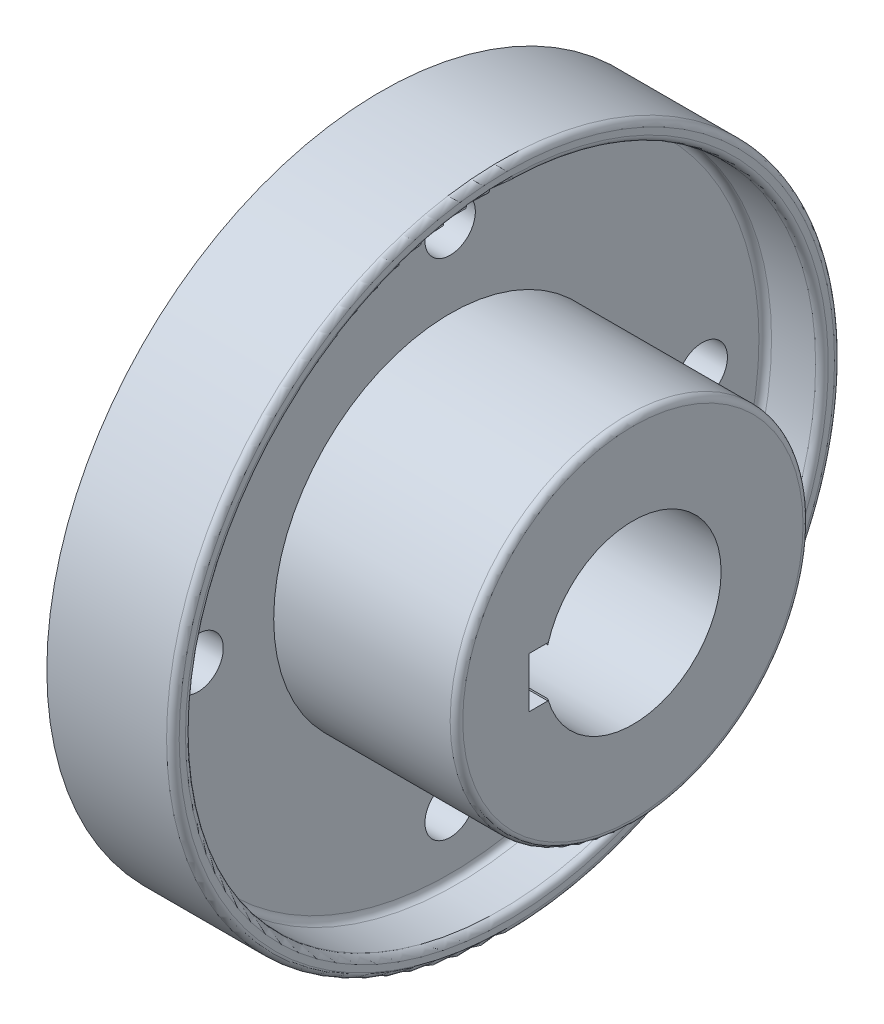
ISO-10303-21;
HEADER;
FILE_DESCRIPTION(('STEP AP214'),'2;1');
FILE_NAME('part.step','',(''),(''),'','','');
FILE_SCHEMA(('AUTOMOTIVE_DESIGN { 1 0 10303 214 1 1 1 1 }'));
ENDSEC;
DATA;
#1=APPLICATION_CONTEXT('core data for automotive mechanical design processes');
#2=APPLICATION_PROTOCOL_DEFINITION('international standard','automotive_design',2000,#1);
#3=PRODUCT_CONTEXT('',#1,'mechanical');
#4=PRODUCT('Part','Part','',(#3));
#5=PRODUCT_RELATED_PRODUCT_CATEGORY('part','',(#4));
#6=PRODUCT_DEFINITION_FORMATION('','',#4);
#7=PRODUCT_DEFINITION_CONTEXT('part definition',#1,'design');
#8=PRODUCT_DEFINITION('design','',#6,#7);
#9=PRODUCT_DEFINITION_SHAPE('','',#8);
#10=(LENGTH_UNIT() NAMED_UNIT(*) SI_UNIT(.MILLI.,.METRE.));
#11=(NAMED_UNIT(*) PLANE_ANGLE_UNIT() SI_UNIT($,.RADIAN.));
#12=(NAMED_UNIT(*) SI_UNIT($,.STERADIAN.) SOLID_ANGLE_UNIT());
#13=UNCERTAINTY_MEASURE_WITH_UNIT(LENGTH_MEASURE(1.E-05),#10,'distance_accuracy_value','');
#14=(GEOMETRIC_REPRESENTATION_CONTEXT(3) GLOBAL_UNCERTAINTY_ASSIGNED_CONTEXT((#13)) GLOBAL_UNIT_ASSIGNED_CONTEXT((#10,
#11,#12)) REPRESENTATION_CONTEXT('',''));
#15=CARTESIAN_POINT('',(0.,0.,0.));
#16=DIRECTION('',(0.,0.,1.));
#17=DIRECTION('',(1.,0.,0.));
#18=AXIS2_PLACEMENT_3D('',#15,#16,#17);
#19=CARTESIAN_POINT('',(0.,0.,0.));
#20=DIRECTION('',(1.,0.,0.));
#21=DIRECTION('',(0.,0.,-1.));
#22=AXIS2_PLACEMENT_3D('',#19,#20,#21);
#23=CYLINDRICAL_SURFACE('',#22,28.);
#24=CARTESIAN_POINT('',(80.,0.,0.));
#25=DIRECTION('',(1.,0.,0.));
#26=DIRECTION('',(0.,0.,-1.));
#27=AXIS2_PLACEMENT_3D('',#24,#25,#26);
#28=CIRCLE('',#27,28.);
#29=CARTESIAN_POINT('',(80.,-7.41619848709568,27.));
#30=VERTEX_POINT('',#29);
#31=CARTESIAN_POINT('',(80.,7.41619848709568,27.));
#32=VERTEX_POINT('',#31);
#33=EDGE_CURVE('E143',#30,#32,#28,.T.);
#34=ORIENTED_EDGE('',*,*,#33,.T.);
#35=DIRECTION('',(1.,0.,0.));
#36=VECTOR('',#35,1.);
#37=CARTESIAN_POINT('',(0.,7.41619848709568,27.));
#38=LINE('',#37,#36);
#39=CARTESIAN_POINT('',(6.,7.41619848709568,27.));
#40=VERTEX_POINT('',#39);
#41=EDGE_CURVE('E133',#32,#40,#38,.F.);
#42=ORIENTED_EDGE('',*,*,#41,.T.);
#43=CARTESIAN_POINT('',(6.,0.,0.));
#44=DIRECTION('',(-1.,0.,0.));
#45=DIRECTION('',(0.,0.,1.));
#46=AXIS2_PLACEMENT_3D('',#43,#44,#45);
#47=CIRCLE('',#46,28.);
#48=CARTESIAN_POINT('',(6.,-7.41619848709568,27.));
#49=VERTEX_POINT('',#48);
#50=EDGE_CURVE('E140',#49,#40,#47,.F.);
#51=ORIENTED_EDGE('',*,*,#50,.F.);
#52=DIRECTION('',(1.,0.,0.));
#53=VECTOR('',#52,1.);
#54=CARTESIAN_POINT('',(0.,-7.41619848709568,27.));
#55=LINE('',#54,#53);
#56=EDGE_CURVE('E127',#49,#30,#55,.T.);
#57=ORIENTED_EDGE('',*,*,#56,.T.);
#58=EDGE_LOOP('',(#34,#42,#51,#57));
#59=FACE_BOUND('',#58,.T.);
#60=ADVANCED_FACE('F33',(#59),#23,.F.);
#61=CARTESIAN_POINT('',(0.,106.,0.));
#62=DIRECTION('',(1.,0.,0.));
#63=DIRECTION('',(0.,0.,-1.));
#64=AXIS2_PLACEMENT_3D('',#61,#62,#63);
#65=PLANE('',#64);
#66=CARTESIAN_POINT('',(0.,8.34771439644569E-13,80.));
#67=DIRECTION('',(-1.,0.,0.));
#68=DIRECTION('',(0.,-1.,0.));
#69=AXIS2_PLACEMENT_3D('',#66,#67,#68);
#70=CIRCLE('',#69,8.);
#71=CARTESIAN_POINT('',(0.,-7.99999999999917,80.0000000000001));
#72=VERTEX_POINT('',#71);
#73=EDGE_CURVE('E193',#72,#72,#70,.T.);
#74=ORIENTED_EDGE('',*,*,#73,.F.);
#75=EDGE_LOOP('',(#74));
#76=FACE_BOUND('',#75,.T.);
#77=CARTESIAN_POINT('',(0.,-80.,0.));
#78=DIRECTION('',(-1.,0.,0.));
#79=DIRECTION('',(0.,0.,-1.));
#80=AXIS2_PLACEMENT_3D('',#77,#78,#79);
#81=CIRCLE('',#80,8.);
#82=CARTESIAN_POINT('',(0.,-80.,-8.00000000000001));
#83=VERTEX_POINT('',#82);
#84=EDGE_CURVE('E184',#83,#83,#81,.T.);
#85=ORIENTED_EDGE('',*,*,#84,.F.);
#86=EDGE_LOOP('',(#85));
#87=FACE_BOUND('',#86,.T.);
#88=CARTESIAN_POINT('',(0.,-2.76134425429668E-13,-80.));
#89=DIRECTION('',(-1.,0.,0.));
#90=DIRECTION('',(0.,1.,0.));
#91=AXIS2_PLACEMENT_3D('',#88,#89,#90);
#92=CIRCLE('',#91,8.);
#93=CARTESIAN_POINT('',(0.,7.99999999999973,-80.));
#94=VERTEX_POINT('',#93);
#95=EDGE_CURVE('E181',#94,#94,#92,.T.);
#96=ORIENTED_EDGE('',*,*,#95,.F.);
#97=EDGE_LOOP('',(#96));
#98=FACE_BOUND('',#97,.T.);
#99=CARTESIAN_POINT('',(0.,80.,0.));
#100=DIRECTION('',(-1.,0.,0.));
#101=DIRECTION('',(0.,0.,1.));
#102=AXIS2_PLACEMENT_3D('',#99,#100,#101);
#103=CIRCLE('',#102,8.);
#104=CARTESIAN_POINT('',(0.,80.,8.00000000000001));
#105=VERTEX_POINT('',#104);
#106=EDGE_CURVE('E114',#105,#105,#103,.T.);
#107=ORIENTED_EDGE('',*,*,#106,.F.);
#108=EDGE_LOOP('',(#107));
#109=FACE_BOUND('',#108,.T.);
#110=CARTESIAN_POINT('',(0.,0.,0.));
#111=DIRECTION('',(-1.,0.,0.));
#112=DIRECTION('',(0.,0.,1.));
#113=AXIS2_PLACEMENT_3D('',#110,#111,#112);
#114=CIRCLE('',#113,46.);
#115=CARTESIAN_POINT('',(0.,0.,46.));
#116=VERTEX_POINT('',#115);
#117=EDGE_CURVE('E136',#116,#116,#114,.T.);
#118=ORIENTED_EDGE('',*,*,#117,.F.);
#119=EDGE_LOOP('',(#118));
#120=FACE_BOUND('',#119,.T.);
#121=CARTESIAN_POINT('',(0.,0.,0.));
#122=DIRECTION('',(-1.,0.,0.));
#123=DIRECTION('',(0.,0.,1.));
#124=AXIS2_PLACEMENT_3D('',#121,#122,#123);
#125=CIRCLE('',#124,106.);
#126=CARTESIAN_POINT('',(0.,0.,106.));
#127=VERTEX_POINT('',#126);
#128=EDGE_CURVE('E146',#127,#127,#125,.T.);
#129=ORIENTED_EDGE('',*,*,#128,.T.);
#130=EDGE_LOOP('',(#129));
#131=FACE_BOUND('',#130,.T.);
#132=ADVANCED_FACE('F35',(#76,#87,#98,#109,#120,#131),#65,.F.);
#133=CARTESIAN_POINT('',(80.,0.,0.));
#134=DIRECTION('',(-1.,0.,0.));
#135=DIRECTION('',(0.,0.,1.));
#136=AXIS2_PLACEMENT_3D('',#133,#134,#135);
#137=PLANE('',#136);
#138=ORIENTED_EDGE('',*,*,#33,.F.);
#139=DIRECTION('',(0.,-1.,0.));
#140=VECTOR('',#139,1.);
#141=CARTESIAN_POINT('',(80.,-8.,27.));
#142=LINE('',#141,#140);
#143=CARTESIAN_POINT('',(80.,-8.,27.));
#144=VERTEX_POINT('',#143);
#145=EDGE_CURVE('E58',#30,#144,#142,.T.);
#146=ORIENTED_EDGE('',*,*,#145,.T.);
#147=DIRECTION('',(0.,0.,1.));
#148=VECTOR('',#147,1.);
#149=CARTESIAN_POINT('',(80.,-8.,27.));
#150=LINE('',#149,#148);
#151=CARTESIAN_POINT('',(80.,-8.,33.));
#152=VERTEX_POINT('',#151);
#153=EDGE_CURVE('E95',#144,#152,#150,.T.);
#154=ORIENTED_EDGE('',*,*,#153,.T.);
#155=DIRECTION('',(0.,1.,0.));
#156=VECTOR('',#155,1.);
#157=CARTESIAN_POINT('',(80.,-8.,33.));
#158=LINE('',#157,#156);
#159=CARTESIAN_POINT('',(80.,8.,33.));
#160=VERTEX_POINT('',#159);
#161=EDGE_CURVE('E89',#152,#160,#158,.T.);
#162=ORIENTED_EDGE('',*,*,#161,.T.);
#163=DIRECTION('',(0.,0.,-1.));
#164=VECTOR('',#163,1.);
#165=CARTESIAN_POINT('',(80.,8.,27.));
#166=LINE('',#165,#164);
#167=CARTESIAN_POINT('',(80.,8.,27.));
#168=VERTEX_POINT('',#167);
#169=EDGE_CURVE('E98',#160,#168,#166,.T.);
#170=ORIENTED_EDGE('',*,*,#169,.T.);
#171=EDGE_CURVE('E117',#168,#32,#142,.T.);
#172=ORIENTED_EDGE('',*,*,#171,.T.);
#173=EDGE_LOOP('',(#138,#146,#154,#162,#170,#172));
#174=FACE_BOUND('',#173,.T.);
#175=CARTESIAN_POINT('',(80.,0.,0.));
#176=DIRECTION('',(-1.,0.,0.));
#177=DIRECTION('',(0.,0.,1.));
#178=AXIS2_PLACEMENT_3D('',#175,#176,#177);
#179=CIRCLE('',#178,54.);
#180=CARTESIAN_POINT('',(80.,0.,54.));
#181=VERTEX_POINT('',#180);
#182=EDGE_CURVE('E42',#181,#181,#179,.T.);
#183=ORIENTED_EDGE('',*,*,#182,.F.);
#184=EDGE_LOOP('',(#183));
#185=FACE_BOUND('',#184,.T.);
#186=ADVANCED_FACE('F105',(#174,#185),#137,.F.);
#187=CARTESIAN_POINT('',(78.,0.,0.));
#188=DIRECTION('',(-1.,0.,0.));
#189=DIRECTION('',(0.,0.,1.));
#190=AXIS2_PLACEMENT_3D('',#187,#188,#189);
#191=TOROIDAL_SURFACE('',#190,54.,2.);
#192=CARTESIAN_POINT('',(78.,0.,0.));
#193=DIRECTION('',(-1.,0.,0.));
#194=DIRECTION('',(0.,0.,1.));
#195=AXIS2_PLACEMENT_3D('',#192,#193,#194);
#196=CIRCLE('',#195,56.);
#197=CARTESIAN_POINT('',(78.,0.,56.));
#198=VERTEX_POINT('',#197);
#199=EDGE_CURVE('E170',#198,#198,#196,.T.);
#200=ORIENTED_EDGE('',*,*,#199,.F.);
#201=EDGE_LOOP('',(#200));
#202=FACE_BOUND('',#201,.T.);
#203=ORIENTED_EDGE('',*,*,#182,.T.);
#204=EDGE_LOOP('',(#203));
#205=FACE_BOUND('',#204,.T.);
#206=ADVANCED_FACE('F260',(#202,#205),#191,.T.);
#207=CARTESIAN_POINT('',(0.,0.,0.));
#208=DIRECTION('',(-1.,0.,0.));
#209=DIRECTION('',(0.,0.,1.));
#210=AXIS2_PLACEMENT_3D('',#207,#208,#209);
#211=CYLINDRICAL_SURFACE('',#210,56.);
#212=CARTESIAN_POINT('',(22.,0.,0.));
#213=DIRECTION('',(-1.,0.,0.));
#214=DIRECTION('',(0.,0.,1.));
#215=AXIS2_PLACEMENT_3D('',#212,#213,#214);
#216=CIRCLE('',#215,56.);
#217=CARTESIAN_POINT('',(22.,0.,56.));
#218=VERTEX_POINT('',#217);
#219=EDGE_CURVE('E167',#218,#218,#216,.T.);
#220=ORIENTED_EDGE('',*,*,#219,.F.);
#221=EDGE_LOOP('',(#220));
#222=FACE_BOUND('',#221,.T.);
#223=ORIENTED_EDGE('',*,*,#199,.T.);
#224=EDGE_LOOP('',(#223));
#225=FACE_BOUND('',#224,.T.);
#226=ADVANCED_FACE('F253',(#222,#225),#211,.T.);
#227=CARTESIAN_POINT('',(22.,98.,0.));
#228=DIRECTION('',(-1.,0.,0.));
#229=DIRECTION('',(0.,0.,1.));
#230=AXIS2_PLACEMENT_3D('',#227,#228,#229);
#231=PLANE('',#230);
#232=CARTESIAN_POINT('',(22.,8.34771439644569E-13,80.));
#233=DIRECTION('',(-1.,0.,0.));
#234=DIRECTION('',(0.,0.,1.));
#235=AXIS2_PLACEMENT_3D('',#232,#233,#234);
#236=CIRCLE('',#235,8.);
#237=CARTESIAN_POINT('',(22.,8.34771439644569E-13,88.));
#238=VERTEX_POINT('',#237);
#239=EDGE_CURVE('E37',#238,#238,#236,.T.);
#240=ORIENTED_EDGE('',*,*,#239,.T.);
#241=EDGE_LOOP('',(#240));
#242=FACE_BOUND('',#241,.T.);
#243=CARTESIAN_POINT('',(22.,-80.,0.));
#244=DIRECTION('',(-1.,0.,0.));
#245=DIRECTION('',(0.,0.,1.));
#246=AXIS2_PLACEMENT_3D('',#243,#244,#245);
#247=CIRCLE('',#246,8.);
#248=CARTESIAN_POINT('',(22.,-80.,8.));
#249=VERTEX_POINT('',#248);
#250=EDGE_CURVE('E182',#249,#249,#247,.T.);
#251=ORIENTED_EDGE('',*,*,#250,.T.);
#252=EDGE_LOOP('',(#251));
#253=FACE_BOUND('',#252,.T.);
#254=CARTESIAN_POINT('',(22.,-2.76134425429668E-13,-80.));
#255=DIRECTION('',(-1.,0.,0.));
#256=DIRECTION('',(0.,0.,1.));
#257=AXIS2_PLACEMENT_3D('',#254,#255,#256);
#258=CIRCLE('',#257,8.);
#259=CARTESIAN_POINT('',(22.,-2.76134425429668E-13,-72.));
#260=VERTEX_POINT('',#259);
#261=EDGE_CURVE('E179',#260,#260,#258,.T.);
#262=ORIENTED_EDGE('',*,*,#261,.T.);
#263=EDGE_LOOP('',(#262));
#264=FACE_BOUND('',#263,.T.);
#265=CARTESIAN_POINT('',(22.,80.,0.));
#266=DIRECTION('',(-1.,0.,0.));
#267=DIRECTION('',(0.,0.,1.));
#268=AXIS2_PLACEMENT_3D('',#265,#266,#267);
#269=CIRCLE('',#268,8.);
#270=CARTESIAN_POINT('',(22.,80.,8.00000000000001));
#271=VERTEX_POINT('',#270);
#272=EDGE_CURVE('E122',#271,#271,#269,.T.);
#273=ORIENTED_EDGE('',*,*,#272,.T.);
#274=EDGE_LOOP('',(#273));
#275=FACE_BOUND('',#274,.T.);
#276=CARTESIAN_POINT('',(22.,0.,0.));
#277=DIRECTION('',(-1.,0.,0.));
#278=DIRECTION('',(0.,0.,1.));
#279=AXIS2_PLACEMENT_3D('',#276,#277,#278);
#280=CIRCLE('',#279,98.);
#281=CARTESIAN_POINT('',(22.,0.,98.));
#282=VERTEX_POINT('',#281);
#283=EDGE_CURVE('E164',#282,#282,#280,.T.);
#284=ORIENTED_EDGE('',*,*,#283,.F.);
#285=EDGE_LOOP('',(#284));
#286=FACE_BOUND('',#285,.T.);
#287=ORIENTED_EDGE('',*,*,#219,.T.);
#288=EDGE_LOOP('',(#287));
#289=FACE_BOUND('',#288,.T.);
#290=ADVANCED_FACE('F247',(#242,#253,#264,#275,#286,#289),#231,.F.);
#291=CARTESIAN_POINT('',(24.,0.,0.));
#292=DIRECTION('',(-1.,0.,0.));
#293=DIRECTION('',(0.,0.,1.));
#294=AXIS2_PLACEMENT_3D('',#291,#292,#293);
#295=TOROIDAL_SURFACE('',#294,98.,2.);
#296=CARTESIAN_POINT('',(24.,0.,0.));
#297=DIRECTION('',(-1.,0.,0.));
#298=DIRECTION('',(0.,0.,1.));
#299=AXIS2_PLACEMENT_3D('',#296,#297,#298);
#300=CIRCLE('',#299,100.);
#301=CARTESIAN_POINT('',(24.,0.,100.));
#302=VERTEX_POINT('',#301);
#303=EDGE_CURVE('E161',#302,#302,#300,.T.);
#304=ORIENTED_EDGE('',*,*,#303,.F.);
#305=EDGE_LOOP('',(#304));
#306=FACE_BOUND('',#305,.T.);
#307=ORIENTED_EDGE('',*,*,#283,.T.);
#308=EDGE_LOOP('',(#307));
#309=FACE_BOUND('',#308,.T.);
#310=ADVANCED_FACE('F241',(#306,#309),#295,.F.);
#311=CARTESIAN_POINT('',(0.,0.,0.));
#312=DIRECTION('',(-1.,0.,0.));
#313=DIRECTION('',(0.,0.,1.));
#314=AXIS2_PLACEMENT_3D('',#311,#312,#313);
#315=CYLINDRICAL_SURFACE('',#314,100.);
#316=CARTESIAN_POINT('',(38.,0.,0.));
#317=DIRECTION('',(-1.,0.,0.));
#318=DIRECTION('',(0.,0.,1.));
#319=AXIS2_PLACEMENT_3D('',#316,#317,#318);
#320=CIRCLE('',#319,100.);
#321=CARTESIAN_POINT('',(38.,0.,100.));
#322=VERTEX_POINT('',#321);
#323=EDGE_CURVE('E158',#322,#322,#320,.T.);
#324=ORIENTED_EDGE('',*,*,#323,.F.);
#325=EDGE_LOOP('',(#324));
#326=FACE_BOUND('',#325,.T.);
#327=ORIENTED_EDGE('',*,*,#303,.T.);
#328=EDGE_LOOP('',(#327));
#329=FACE_BOUND('',#328,.T.);
#330=ADVANCED_FACE('F235',(#326,#329),#315,.F.);
#331=CARTESIAN_POINT('',(38.,0.,0.));
#332=DIRECTION('',(-1.,0.,0.));
#333=DIRECTION('',(0.,0.,1.));
#334=AXIS2_PLACEMENT_3D('',#331,#332,#333);
#335=TOROIDAL_SURFACE('',#334,102.,2.);
#336=CARTESIAN_POINT('',(40.,0.,0.));
#337=DIRECTION('',(-1.,0.,0.));
#338=DIRECTION('',(0.,0.,1.));
#339=AXIS2_PLACEMENT_3D('',#336,#337,#338);
#340=CIRCLE('',#339,102.);
#341=CARTESIAN_POINT('',(40.,0.,102.));
#342=VERTEX_POINT('',#341);
#343=EDGE_CURVE('E155',#342,#342,#340,.T.);
#344=ORIENTED_EDGE('',*,*,#343,.F.);
#345=EDGE_LOOP('',(#344));
#346=FACE_BOUND('',#345,.T.);
#347=ORIENTED_EDGE('',*,*,#323,.T.);
#348=EDGE_LOOP('',(#347));
#349=FACE_BOUND('',#348,.T.);
#350=ADVANCED_FACE('F229',(#346,#349),#335,.T.);
#351=CARTESIAN_POINT('',(40.,104.,0.));
#352=DIRECTION('',(-1.,0.,0.));
#353=DIRECTION('',(0.,0.,1.));
#354=AXIS2_PLACEMENT_3D('',#351,#352,#353);
#355=PLANE('',#354);
#356=CARTESIAN_POINT('',(40.,0.,0.));
#357=DIRECTION('',(-1.,0.,0.));
#358=DIRECTION('',(0.,0.,1.));
#359=AXIS2_PLACEMENT_3D('',#356,#357,#358);
#360=CIRCLE('',#359,104.);
#361=CARTESIAN_POINT('',(40.,0.,104.));
#362=VERTEX_POINT('',#361);
#363=EDGE_CURVE('E152',#362,#362,#360,.T.);
#364=ORIENTED_EDGE('',*,*,#363,.F.);
#365=EDGE_LOOP('',(#364));
#366=FACE_BOUND('',#365,.T.);
#367=ORIENTED_EDGE('',*,*,#343,.T.);
#368=EDGE_LOOP('',(#367));
#369=FACE_BOUND('',#368,.T.);
#370=ADVANCED_FACE('F223',(#366,#369),#355,.F.);
#371=CARTESIAN_POINT('',(38.,0.,0.));
#372=DIRECTION('',(-1.,0.,0.));
#373=DIRECTION('',(0.,0.,1.));
#374=AXIS2_PLACEMENT_3D('',#371,#372,#373);
#375=TOROIDAL_SURFACE('',#374,104.,2.);
#376=CARTESIAN_POINT('',(38.,0.,0.));
#377=DIRECTION('',(-1.,0.,0.));
#378=DIRECTION('',(0.,0.,1.));
#379=AXIS2_PLACEMENT_3D('',#376,#377,#378);
#380=CIRCLE('',#379,106.);
#381=CARTESIAN_POINT('',(38.,0.,106.));
#382=VERTEX_POINT('',#381);
#383=EDGE_CURVE('E149',#382,#382,#380,.T.);
#384=ORIENTED_EDGE('',*,*,#383,.F.);
#385=EDGE_LOOP('',(#384));
#386=FACE_BOUND('',#385,.T.);
#387=ORIENTED_EDGE('',*,*,#363,.T.);
#388=EDGE_LOOP('',(#387));
#389=FACE_BOUND('',#388,.T.);
#390=ADVANCED_FACE('F217',(#386,#389),#375,.T.);
#391=CARTESIAN_POINT('',(0.,0.,0.));
#392=DIRECTION('',(-1.,0.,0.));
#393=DIRECTION('',(0.,0.,1.));
#394=AXIS2_PLACEMENT_3D('',#391,#392,#393);
#395=CYLINDRICAL_SURFACE('',#394,106.);
#396=ORIENTED_EDGE('',*,*,#128,.F.);
#397=EDGE_LOOP('',(#396));
#398=FACE_BOUND('',#397,.T.);
#399=ORIENTED_EDGE('',*,*,#383,.T.);
#400=EDGE_LOOP('',(#399));
#401=FACE_BOUND('',#400,.T.);
#402=ADVANCED_FACE('F213',(#398,#401),#395,.T.);
#403=CARTESIAN_POINT('',(6.,0.,0.));
#404=DIRECTION('',(-1.,0.,0.));
#405=DIRECTION('',(0.,0.,1.));
#406=AXIS2_PLACEMENT_3D('',#403,#404,#405);
#407=PLANE('',#406);
#408=DIRECTION('',(0.,-1.,0.));
#409=VECTOR('',#408,1.);
#410=CARTESIAN_POINT('',(6.,0.,27.));
#411=LINE('',#410,#409);
#412=CARTESIAN_POINT('',(6.,-8.,27.));
#413=VERTEX_POINT('',#412);
#414=EDGE_CURVE('E11',#49,#413,#411,.T.);
#415=ORIENTED_EDGE('',*,*,#414,.F.);
#416=ORIENTED_EDGE('',*,*,#50,.T.);
#417=DIRECTION('',(0.,-1.,0.));
#418=VECTOR('',#417,1.);
#419=CARTESIAN_POINT('',(6.,-8.,27.));
#420=LINE('',#419,#418);
#421=CARTESIAN_POINT('',(6.,8.,27.));
#422=VERTEX_POINT('',#421);
#423=EDGE_CURVE('E111',#422,#40,#420,.T.);
#424=ORIENTED_EDGE('',*,*,#423,.F.);
#425=DIRECTION('',(0.,0.,-1.));
#426=VECTOR('',#425,1.);
#427=CARTESIAN_POINT('',(6.,8.,27.));
#428=LINE('',#427,#426);
#429=CARTESIAN_POINT('',(6.,8.,33.));
#430=VERTEX_POINT('',#429);
#431=EDGE_CURVE('E121',#430,#422,#428,.T.);
#432=ORIENTED_EDGE('',*,*,#431,.F.);
#433=DIRECTION('',(0.,1.,0.));
#434=VECTOR('',#433,1.);
#435=CARTESIAN_POINT('',(6.,-8.,33.));
#436=LINE('',#435,#434);
#437=CARTESIAN_POINT('',(6.,-8.,33.));
#438=VERTEX_POINT('',#437);
#439=EDGE_CURVE('E50',#438,#430,#436,.T.);
#440=ORIENTED_EDGE('',*,*,#439,.F.);
#441=DIRECTION('',(0.,0.,1.));
#442=VECTOR('',#441,1.);
#443=CARTESIAN_POINT('',(6.,-8.,27.));
#444=LINE('',#443,#442);
#445=EDGE_CURVE('E108',#413,#438,#444,.T.);
#446=ORIENTED_EDGE('',*,*,#445,.F.);
#447=EDGE_LOOP('',(#415,#416,#424,#432,#440,#446));
#448=FACE_BOUND('',#447,.T.);
#449=CARTESIAN_POINT('',(6.,0.,0.));
#450=DIRECTION('',(-1.,0.,0.));
#451=DIRECTION('',(0.,0.,1.));
#452=AXIS2_PLACEMENT_3D('',#449,#450,#451);
#453=CIRCLE('',#452,46.);
#454=CARTESIAN_POINT('',(6.,0.,46.));
#455=VERTEX_POINT('',#454);
#456=EDGE_CURVE('E137',#455,#455,#453,.T.);
#457=ORIENTED_EDGE('',*,*,#456,.T.);
#458=EDGE_LOOP('',(#457));
#459=FACE_BOUND('',#458,.T.);
#460=ADVANCED_FACE('F216',(#448,#459),#407,.T.);
#461=CARTESIAN_POINT('',(6.,0.,0.));
#462=DIRECTION('',(-1.,0.,0.));
#463=DIRECTION('',(0.,0.,1.));
#464=AXIS2_PLACEMENT_3D('',#461,#462,#463);
#465=CYLINDRICAL_SURFACE('',#464,46.);
#466=ORIENTED_EDGE('',*,*,#456,.F.);
#467=EDGE_LOOP('',(#466));
#468=FACE_BOUND('',#467,.T.);
#469=ORIENTED_EDGE('',*,*,#117,.T.);
#470=EDGE_LOOP('',(#469));
#471=FACE_BOUND('',#470,.T.);
#472=ADVANCED_FACE('F277',(#468,#471),#465,.F.);
#473=CARTESIAN_POINT('',(80.,-8.,27.));
#474=DIRECTION('',(0.,0.,-1.));
#475=DIRECTION('',(-1.,0.,0.));
#476=AXIS2_PLACEMENT_3D('',#473,#474,#475);
#477=PLANE('',#476);
#478=ORIENTED_EDGE('',*,*,#171,.F.);
#479=DIRECTION('',(-1.,0.,0.));
#480=VECTOR('',#479,1.);
#481=CARTESIAN_POINT('',(80.,8.,27.));
#482=LINE('',#481,#480);
#483=EDGE_CURVE('E94',#168,#422,#482,.T.);
#484=ORIENTED_EDGE('',*,*,#483,.T.);
#485=ORIENTED_EDGE('',*,*,#423,.T.);
#486=ORIENTED_EDGE('',*,*,#41,.F.);
#487=EDGE_LOOP('',(#478,#484,#485,#486));
#488=FACE_BOUND('',#487,.T.);
#489=ADVANCED_FACE('F280',(#488),#477,.F.);
#490=ORIENTED_EDGE('',*,*,#414,.T.);
#491=DIRECTION('',(-1.,0.,0.));
#492=VECTOR('',#491,1.);
#493=CARTESIAN_POINT('',(80.,-8.,27.));
#494=LINE('',#493,#492);
#495=EDGE_CURVE('E128',#144,#413,#494,.T.);
#496=ORIENTED_EDGE('',*,*,#495,.F.);
#497=ORIENTED_EDGE('',*,*,#145,.F.);
#498=ORIENTED_EDGE('',*,*,#56,.F.);
#499=EDGE_LOOP('',(#490,#496,#497,#498));
#500=FACE_BOUND('',#499,.T.);
#501=ADVANCED_FACE('F288',(#500),#477,.F.);
#502=CARTESIAN_POINT('',(80.,-8.,33.));
#503=DIRECTION('',(0.,0.,1.));
#504=DIRECTION('',(1.,0.,0.));
#505=AXIS2_PLACEMENT_3D('',#502,#503,#504);
#506=PLANE('',#505);
#507=ORIENTED_EDGE('',*,*,#439,.T.);
#508=DIRECTION('',(-1.,0.,0.));
#509=VECTOR('',#508,1.);
#510=CARTESIAN_POINT('',(80.,8.,33.));
#511=LINE('',#510,#509);
#512=EDGE_CURVE('E85',#160,#430,#511,.T.);
#513=ORIENTED_EDGE('',*,*,#512,.F.);
#514=ORIENTED_EDGE('',*,*,#161,.F.);
#515=DIRECTION('',(-1.,0.,0.));
#516=VECTOR('',#515,1.);
#517=CARTESIAN_POINT('',(80.,-8.,33.));
#518=LINE('',#517,#516);
#519=EDGE_CURVE('E125',#152,#438,#518,.T.);
#520=ORIENTED_EDGE('',*,*,#519,.T.);
#521=EDGE_LOOP('',(#507,#513,#514,#520));
#522=FACE_BOUND('',#521,.T.);
#523=ADVANCED_FACE('F87',(#522),#506,.F.);
#524=CARTESIAN_POINT('',(80.,-8.,27.));
#525=DIRECTION('',(0.,-1.,0.));
#526=DIRECTION('',(0.,0.,-1.));
#527=AXIS2_PLACEMENT_3D('',#524,#525,#526);
#528=PLANE('',#527);
#529=ORIENTED_EDGE('',*,*,#445,.T.);
#530=ORIENTED_EDGE('',*,*,#519,.F.);
#531=ORIENTED_EDGE('',*,*,#153,.F.);
#532=ORIENTED_EDGE('',*,*,#495,.T.);
#533=EDGE_LOOP('',(#529,#530,#531,#532));
#534=FACE_BOUND('',#533,.T.);
#535=ADVANCED_FACE('F287',(#534),#528,.F.);
#536=CARTESIAN_POINT('',(80.,8.,27.));
#537=DIRECTION('',(0.,1.,0.));
#538=DIRECTION('',(0.,0.,1.));
#539=AXIS2_PLACEMENT_3D('',#536,#537,#538);
#540=PLANE('',#539);
#541=ORIENTED_EDGE('',*,*,#431,.T.);
#542=ORIENTED_EDGE('',*,*,#483,.F.);
#543=ORIENTED_EDGE('',*,*,#169,.F.);
#544=ORIENTED_EDGE('',*,*,#512,.T.);
#545=EDGE_LOOP('',(#541,#542,#543,#544));
#546=FACE_BOUND('',#545,.T.);
#547=ADVANCED_FACE('F99',(#546),#540,.F.);
#548=CARTESIAN_POINT('',(80.,80.,0.));
#549=DIRECTION('',(-1.,0.,0.));
#550=DIRECTION('',(0.,0.,1.));
#551=AXIS2_PLACEMENT_3D('',#548,#549,#550);
#552=CYLINDRICAL_SURFACE('',#551,8.);
#553=ORIENTED_EDGE('',*,*,#106,.T.);
#554=EDGE_LOOP('',(#553));
#555=FACE_BOUND('',#554,.T.);
#556=ORIENTED_EDGE('',*,*,#272,.F.);
#557=EDGE_LOOP('',(#556));
#558=FACE_BOUND('',#557,.T.);
#559=ADVANCED_FACE('F291',(#555,#558),#552,.F.);
#560=CARTESIAN_POINT('',(80.,-2.76134425429668E-13,-80.));
#561=DIRECTION('',(-1.,0.,0.));
#562=DIRECTION('',(0.,0.,1.));
#563=AXIS2_PLACEMENT_3D('',#560,#561,#562);
#564=CYLINDRICAL_SURFACE('',#563,8.);
#565=ORIENTED_EDGE('',*,*,#95,.T.);
#566=EDGE_LOOP('',(#565));
#567=FACE_BOUND('',#566,.T.);
#568=ORIENTED_EDGE('',*,*,#261,.F.);
#569=EDGE_LOOP('',(#568));
#570=FACE_BOUND('',#569,.T.);
#571=ADVANCED_FACE('F300',(#567,#570),#564,.F.);
#572=CARTESIAN_POINT('',(80.,-80.,0.));
#573=DIRECTION('',(-1.,0.,0.));
#574=DIRECTION('',(0.,0.,1.));
#575=AXIS2_PLACEMENT_3D('',#572,#573,#574);
#576=CYLINDRICAL_SURFACE('',#575,8.);
#577=ORIENTED_EDGE('',*,*,#84,.T.);
#578=EDGE_LOOP('',(#577));
#579=FACE_BOUND('',#578,.T.);
#580=ORIENTED_EDGE('',*,*,#250,.F.);
#581=EDGE_LOOP('',(#580));
#582=FACE_BOUND('',#581,.T.);
#583=ADVANCED_FACE('F304',(#579,#582),#576,.F.);
#584=CARTESIAN_POINT('',(80.,8.34771439644569E-13,80.));
#585=DIRECTION('',(-1.,0.,0.));
#586=DIRECTION('',(0.,0.,1.));
#587=AXIS2_PLACEMENT_3D('',#584,#585,#586);
#588=CYLINDRICAL_SURFACE('',#587,8.);
#589=ORIENTED_EDGE('',*,*,#73,.T.);
#590=EDGE_LOOP('',(#589));
#591=FACE_BOUND('',#590,.T.);
#592=ORIENTED_EDGE('',*,*,#239,.F.);
#593=EDGE_LOOP('',(#592));
#594=FACE_BOUND('',#593,.T.);
#595=ADVANCED_FACE('F198',(#591,#594),#588,.F.);
#596=CLOSED_SHELL('',(#60,#132,#186,#206,#226,#290,#310,#330,#350,#370,#390,#402,#460,#472,#489,
#501,#523,#535,#547,#559,#571,#583,#595));
#597=MANIFOLD_SOLID_BREP('B2',#596);
#598=ADVANCED_BREP_SHAPE_REPRESENTATION('',(#18,#597),#14);
#599=SHAPE_DEFINITION_REPRESENTATION(#9,#598);
ENDSEC;
END-ISO-10303-21;
